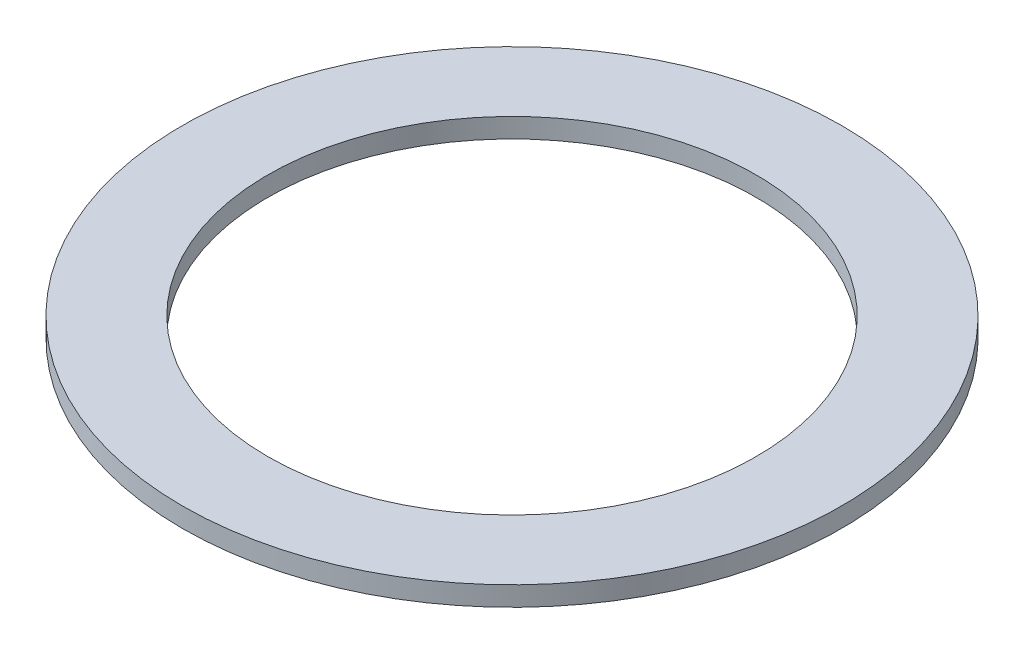
ISO-10303-21;
HEADER;
FILE_DESCRIPTION(('STEP AP214'),'2;1');
FILE_NAME('part.step','',(''),(''),'','','');
FILE_SCHEMA(('AUTOMOTIVE_DESIGN { 1 0 10303 214 1 1 1 1 }'));
ENDSEC;
DATA;
#1=APPLICATION_CONTEXT('core data for automotive mechanical design processes');
#2=APPLICATION_PROTOCOL_DEFINITION('international standard','automotive_design',2000,#1);
#3=PRODUCT_CONTEXT('',#1,'mechanical');
#4=PRODUCT('Part','Part','',(#3));
#5=PRODUCT_RELATED_PRODUCT_CATEGORY('part','',(#4));
#6=PRODUCT_DEFINITION_FORMATION('','',#4);
#7=PRODUCT_DEFINITION_CONTEXT('part definition',#1,'design');
#8=PRODUCT_DEFINITION('design','',#6,#7);
#9=PRODUCT_DEFINITION_SHAPE('','',#8);
#10=(LENGTH_UNIT() NAMED_UNIT(*) SI_UNIT(.MILLI.,.METRE.));
#11=(NAMED_UNIT(*) PLANE_ANGLE_UNIT() SI_UNIT($,.RADIAN.));
#12=(NAMED_UNIT(*) SI_UNIT($,.STERADIAN.) SOLID_ANGLE_UNIT());
#13=UNCERTAINTY_MEASURE_WITH_UNIT(LENGTH_MEASURE(1.E-05),#10,'distance_accuracy_value','');
#14=(GEOMETRIC_REPRESENTATION_CONTEXT(3) GLOBAL_UNCERTAINTY_ASSIGNED_CONTEXT((#13)) GLOBAL_UNIT_ASSIGNED_CONTEXT((#10,
#11,#12)) REPRESENTATION_CONTEXT('',''));
#15=CARTESIAN_POINT('',(0.,0.,0.));
#16=DIRECTION('',(0.,0.,1.));
#17=DIRECTION('',(1.,0.,0.));
#18=AXIS2_PLACEMENT_3D('',#15,#16,#17);
#19=CARTESIAN_POINT('',(0.,4.,0.));
#20=DIRECTION('',(0.,1.,0.));
#21=DIRECTION('',(0.,0.,1.));
#22=AXIS2_PLACEMENT_3D('',#19,#20,#21);
#23=PLANE('',#22);
#24=CARTESIAN_POINT('',(0.,4.,0.));
#25=DIRECTION('',(0.,1.,0.));
#26=DIRECTION('',(0.,0.,1.));
#27=AXIS2_PLACEMENT_3D('',#24,#25,#26);
#28=CIRCLE('',#27,67.5);
#29=CARTESIAN_POINT('',(0.,4.,67.5));
#30=VERTEX_POINT('',#29);
#31=EDGE_CURVE('E10',#30,#30,#28,.T.);
#32=ORIENTED_EDGE('',*,*,#31,.T.);
#33=EDGE_LOOP('',(#32));
#34=FACE_BOUND('',#33,.T.);
#35=CARTESIAN_POINT('',(0.,4.,0.));
#36=DIRECTION('',(0.,1.,0.));
#37=DIRECTION('',(0.,0.,1.));
#38=AXIS2_PLACEMENT_3D('',#35,#36,#37);
#39=CIRCLE('',#38,50.);
#40=CARTESIAN_POINT('',(0.,4.,50.));
#41=VERTEX_POINT('',#40);
#42=EDGE_CURVE('E43',#41,#41,#39,.T.);
#43=ORIENTED_EDGE('',*,*,#42,.F.);
#44=EDGE_LOOP('',(#43));
#45=FACE_BOUND('',#44,.T.);
#46=ADVANCED_FACE('F32',(#34,#45),#23,.T.);
#47=CARTESIAN_POINT('',(0.,0.,0.));
#48=DIRECTION('',(0.,1.,0.));
#49=DIRECTION('',(0.,0.,1.));
#50=AXIS2_PLACEMENT_3D('',#47,#48,#49);
#51=PLANE('',#50);
#52=CARTESIAN_POINT('',(0.,0.,0.));
#53=DIRECTION('',(0.,1.,0.));
#54=DIRECTION('',(0.,0.,1.));
#55=AXIS2_PLACEMENT_3D('',#52,#53,#54);
#56=CIRCLE('',#55,67.5);
#57=CARTESIAN_POINT('',(0.,0.,67.5));
#58=VERTEX_POINT('',#57);
#59=EDGE_CURVE('E36',#58,#58,#56,.T.);
#60=ORIENTED_EDGE('',*,*,#59,.F.);
#61=EDGE_LOOP('',(#60));
#62=FACE_BOUND('',#61,.T.);
#63=CARTESIAN_POINT('',(0.,0.,0.));
#64=DIRECTION('',(0.,1.,0.));
#65=DIRECTION('',(0.,0.,1.));
#66=AXIS2_PLACEMENT_3D('',#63,#64,#65);
#67=CIRCLE('',#66,50.);
#68=CARTESIAN_POINT('',(0.,0.,50.));
#69=VERTEX_POINT('',#68);
#70=EDGE_CURVE('E45',#69,#69,#67,.T.);
#71=ORIENTED_EDGE('',*,*,#70,.T.);
#72=EDGE_LOOP('',(#71));
#73=FACE_BOUND('',#72,.T.);
#74=ADVANCED_FACE('F55',(#62,#73),#51,.F.);
#75=CARTESIAN_POINT('',(0.,4.,0.));
#76=DIRECTION('',(0.,-1.,0.));
#77=DIRECTION('',(0.,0.,-1.));
#78=AXIS2_PLACEMENT_3D('',#75,#76,#77);
#79=CYLINDRICAL_SURFACE('',#78,67.5);
#80=ORIENTED_EDGE('',*,*,#31,.F.);
#81=EDGE_LOOP('',(#80));
#82=FACE_BOUND('',#81,.T.);
#83=ORIENTED_EDGE('',*,*,#59,.T.);
#84=EDGE_LOOP('',(#83));
#85=FACE_BOUND('',#84,.T.);
#86=ADVANCED_FACE('F34',(#82,#85),#79,.T.);
#87=CARTESIAN_POINT('',(0.,4.,0.));
#88=DIRECTION('',(0.,-1.,0.));
#89=DIRECTION('',(0.,0.,-1.));
#90=AXIS2_PLACEMENT_3D('',#87,#88,#89);
#91=CYLINDRICAL_SURFACE('',#90,50.);
#92=ORIENTED_EDGE('',*,*,#42,.T.);
#93=EDGE_LOOP('',(#92));
#94=FACE_BOUND('',#93,.T.);
#95=ORIENTED_EDGE('',*,*,#70,.F.);
#96=EDGE_LOOP('',(#95));
#97=FACE_BOUND('',#96,.T.);
#98=ADVANCED_FACE('F51',(#94,#97),#91,.F.);
#99=CLOSED_SHELL('',(#46,#74,#86,#98));
#100=MANIFOLD_SOLID_BREP('B2',#99);
#101=ADVANCED_BREP_SHAPE_REPRESENTATION('',(#18,#100),#14);
#102=SHAPE_DEFINITION_REPRESENTATION(#9,#101);
ENDSEC;
END-ISO-10303-21;
